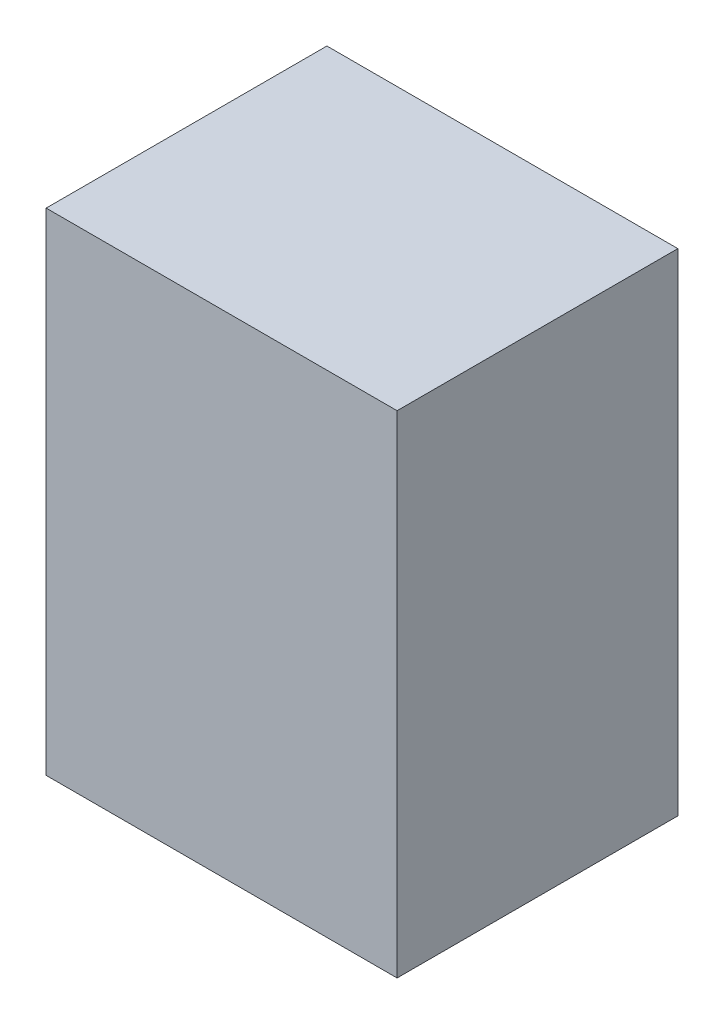
ISO-10303-21;
HEADER;
FILE_DESCRIPTION(('STEP AP214'),'2;1');
FILE_NAME('part.step','',(''),(''),'','','');
FILE_SCHEMA(('AUTOMOTIVE_DESIGN { 1 0 10303 214 1 1 1 1 }'));
ENDSEC;
DATA;
#1=APPLICATION_CONTEXT('core data for automotive mechanical design processes');
#2=APPLICATION_PROTOCOL_DEFINITION('international standard','automotive_design',2000,#1);
#3=PRODUCT_CONTEXT('',#1,'mechanical');
#4=PRODUCT('Part','Part','',(#3));
#5=PRODUCT_RELATED_PRODUCT_CATEGORY('part','',(#4));
#6=PRODUCT_DEFINITION_FORMATION('','',#4);
#7=PRODUCT_DEFINITION_CONTEXT('part definition',#1,'design');
#8=PRODUCT_DEFINITION('design','',#6,#7);
#9=PRODUCT_DEFINITION_SHAPE('','',#8);
#10=(LENGTH_UNIT() NAMED_UNIT(*) SI_UNIT(.MILLI.,.METRE.));
#11=(NAMED_UNIT(*) PLANE_ANGLE_UNIT() SI_UNIT($,.RADIAN.));
#12=(NAMED_UNIT(*) SI_UNIT($,.STERADIAN.) SOLID_ANGLE_UNIT());
#13=UNCERTAINTY_MEASURE_WITH_UNIT(LENGTH_MEASURE(1.E-05),#10,'distance_accuracy_value','');
#14=(GEOMETRIC_REPRESENTATION_CONTEXT(3) GLOBAL_UNCERTAINTY_ASSIGNED_CONTEXT((#13)) GLOBAL_UNIT_ASSIGNED_CONTEXT((#10,
#11,#12)) REPRESENTATION_CONTEXT('',''));
#15=CARTESIAN_POINT('',(0.,0.,0.));
#16=DIRECTION('',(0.,0.,1.));
#17=DIRECTION('',(1.,0.,0.));
#18=AXIS2_PLACEMENT_3D('',#15,#16,#17);
#19=CARTESIAN_POINT('',(0.,355.6,0.));
#20=DIRECTION('',(1.,0.,0.));
#21=DIRECTION('',(0.,0.,-1.));
#22=AXIS2_PLACEMENT_3D('',#19,#20,#21);
#23=PLANE('',#22);
#24=DIRECTION('',(0.,0.,1.));
#25=VECTOR('',#24,1.);
#26=CARTESIAN_POINT('',(0.,0.,0.));
#27=LINE('',#26,#25);
#28=CARTESIAN_POINT('',(0.,0.,-203.2));
#29=VERTEX_POINT('',#28);
#30=CARTESIAN_POINT('',(0.,0.,0.));
#31=VERTEX_POINT('',#30);
#32=EDGE_CURVE('E158',#29,#31,#27,.T.);
#33=ORIENTED_EDGE('',*,*,#32,.T.);
#34=DIRECTION('',(0.,-1.,0.));
#35=VECTOR('',#34,1.);
#36=CARTESIAN_POINT('',(0.,355.6,0.));
#37=LINE('',#36,#35);
#38=CARTESIAN_POINT('',(0.,355.6,0.));
#39=VERTEX_POINT('',#38);
#40=EDGE_CURVE('E12',#39,#31,#37,.T.);
#41=ORIENTED_EDGE('',*,*,#40,.F.);
#42=DIRECTION('',(0.,0.,1.));
#43=VECTOR('',#42,1.);
#44=CARTESIAN_POINT('',(0.,355.6,0.));
#45=LINE('',#44,#43);
#46=CARTESIAN_POINT('',(0.,355.6,-203.2));
#47=VERTEX_POINT('',#46);
#48=EDGE_CURVE('E143',#47,#39,#45,.T.);
#49=ORIENTED_EDGE('',*,*,#48,.F.);
#50=DIRECTION('',(0.,-1.,0.));
#51=VECTOR('',#50,1.);
#52=CARTESIAN_POINT('',(0.,355.6,-203.2));
#53=LINE('',#52,#51);
#54=EDGE_CURVE('E157',#47,#29,#53,.T.);
#55=ORIENTED_EDGE('',*,*,#54,.T.);
#56=EDGE_LOOP('',(#33,#41,#49,#55));
#57=FACE_BOUND('',#56,.T.);
#58=ADVANCED_FACE('F95',(#57),#23,.F.);
#59=CARTESIAN_POINT('',(0.,355.6,0.));
#60=DIRECTION('',(0.,0.,-1.));
#61=DIRECTION('',(-1.,0.,0.));
#62=AXIS2_PLACEMENT_3D('',#59,#60,#61);
#63=PLANE('',#62);
#64=DIRECTION('',(1.,0.,0.));
#65=VECTOR('',#64,1.);
#66=CARTESIAN_POINT('',(0.,0.,0.));
#67=LINE('',#66,#65);
#68=CARTESIAN_POINT('',(254.,0.,0.));
#69=VERTEX_POINT('',#68);
#70=EDGE_CURVE('E146',#31,#69,#67,.T.);
#71=ORIENTED_EDGE('',*,*,#70,.T.);
#72=DIRECTION('',(0.,-1.,0.));
#73=VECTOR('',#72,1.);
#74=CARTESIAN_POINT('',(254.,355.6,0.));
#75=LINE('',#74,#73);
#76=CARTESIAN_POINT('',(254.,355.6,0.));
#77=VERTEX_POINT('',#76);
#78=EDGE_CURVE('E102',#77,#69,#75,.T.);
#79=ORIENTED_EDGE('',*,*,#78,.F.);
#80=DIRECTION('',(1.,0.,0.));
#81=VECTOR('',#80,1.);
#82=CARTESIAN_POINT('',(0.,355.6,0.));
#83=LINE('',#82,#81);
#84=EDGE_CURVE('E137',#39,#77,#83,.T.);
#85=ORIENTED_EDGE('',*,*,#84,.F.);
#86=ORIENTED_EDGE('',*,*,#40,.T.);
#87=EDGE_LOOP('',(#71,#79,#85,#86));
#88=FACE_BOUND('',#87,.T.);
#89=ADVANCED_FACE('F149',(#88),#63,.F.);
#90=CARTESIAN_POINT('',(254.,355.6,0.));
#91=DIRECTION('',(-1.,0.,0.));
#92=DIRECTION('',(0.,0.,1.));
#93=AXIS2_PLACEMENT_3D('',#90,#91,#92);
#94=PLANE('',#93);
#95=DIRECTION('',(0.,0.,-1.));
#96=VECTOR('',#95,1.);
#97=CARTESIAN_POINT('',(254.,0.,0.));
#98=LINE('',#97,#96);
#99=CARTESIAN_POINT('',(254.,0.,-203.2));
#100=VERTEX_POINT('',#99);
#101=EDGE_CURVE('E128',#69,#100,#98,.T.);
#102=ORIENTED_EDGE('',*,*,#101,.T.);
#103=DIRECTION('',(0.,-1.,0.));
#104=VECTOR('',#103,1.);
#105=CARTESIAN_POINT('',(254.,355.6,-203.2));
#106=LINE('',#105,#104);
#107=CARTESIAN_POINT('',(254.,355.6,-203.2));
#108=VERTEX_POINT('',#107);
#109=EDGE_CURVE('E151',#108,#100,#106,.T.);
#110=ORIENTED_EDGE('',*,*,#109,.F.);
#111=DIRECTION('',(0.,0.,-1.));
#112=VECTOR('',#111,1.);
#113=CARTESIAN_POINT('',(254.,355.6,0.));
#114=LINE('',#113,#112);
#115=EDGE_CURVE('E145',#77,#108,#114,.T.);
#116=ORIENTED_EDGE('',*,*,#115,.F.);
#117=ORIENTED_EDGE('',*,*,#78,.T.);
#118=EDGE_LOOP('',(#102,#110,#116,#117));
#119=FACE_BOUND('',#118,.T.);
#120=ADVANCED_FACE('F152',(#119),#94,.F.);
#121=CARTESIAN_POINT('',(0.,355.6,-203.2));
#122=DIRECTION('',(0.,0.,1.));
#123=DIRECTION('',(1.,0.,0.));
#124=AXIS2_PLACEMENT_3D('',#121,#122,#123);
#125=PLANE('',#124);
#126=DIRECTION('',(-1.,0.,0.));
#127=VECTOR('',#126,1.);
#128=CARTESIAN_POINT('',(0.,0.,-203.2));
#129=LINE('',#128,#127);
#130=EDGE_CURVE('E135',#100,#29,#129,.T.);
#131=ORIENTED_EDGE('',*,*,#130,.T.);
#132=ORIENTED_EDGE('',*,*,#54,.F.);
#133=DIRECTION('',(-1.,0.,0.));
#134=VECTOR('',#133,1.);
#135=CARTESIAN_POINT('',(0.,355.6,-203.2));
#136=LINE('',#135,#134);
#137=EDGE_CURVE('E108',#108,#47,#136,.T.);
#138=ORIENTED_EDGE('',*,*,#137,.F.);
#139=ORIENTED_EDGE('',*,*,#109,.T.);
#140=EDGE_LOOP('',(#131,#132,#138,#139));
#141=FACE_BOUND('',#140,.T.);
#142=ADVANCED_FACE('F171',(#141),#125,.F.);
#143=CARTESIAN_POINT('',(0.,355.6,0.));
#144=DIRECTION('',(0.,-1.,0.));
#145=DIRECTION('',(0.,0.,-1.));
#146=AXIS2_PLACEMENT_3D('',#143,#144,#145);
#147=PLANE('',#146);
#148=ORIENTED_EDGE('',*,*,#48,.T.);
#149=ORIENTED_EDGE('',*,*,#84,.T.);
#150=ORIENTED_EDGE('',*,*,#115,.T.);
#151=ORIENTED_EDGE('',*,*,#137,.T.);
#152=EDGE_LOOP('',(#148,#149,#150,#151));
#153=FACE_BOUND('',#152,.T.);
#154=ADVANCED_FACE('F139',(#153),#147,.F.);
#155=CARTESIAN_POINT('',(0.,0.,0.));
#156=DIRECTION('',(0.,-1.,0.));
#157=DIRECTION('',(0.,0.,-1.));
#158=AXIS2_PLACEMENT_3D('',#155,#156,#157);
#159=PLANE('',#158);
#160=ORIENTED_EDGE('',*,*,#32,.F.);
#161=ORIENTED_EDGE('',*,*,#130,.F.);
#162=ORIENTED_EDGE('',*,*,#101,.F.);
#163=ORIENTED_EDGE('',*,*,#70,.F.);
#164=EDGE_LOOP('',(#160,#161,#162,#163));
#165=FACE_BOUND('',#164,.T.);
#166=ADVANCED_FACE('F176',(#165),#159,.T.);
#167=CLOSED_SHELL('',(#58,#89,#120,#142,#154,#166));
#168=MANIFOLD_SOLID_BREP('B2',#167);
#169=ADVANCED_BREP_SHAPE_REPRESENTATION('',(#18,#168),#14);
#170=SHAPE_DEFINITION_REPRESENTATION(#9,#169);
ENDSEC;
END-ISO-10303-21;
